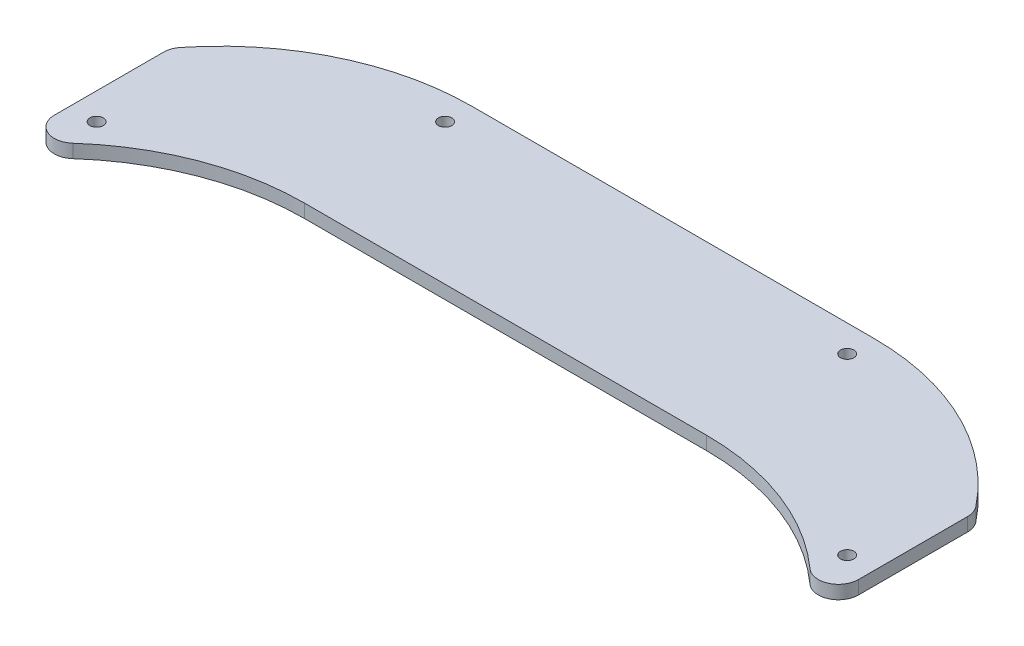
ISO-10303-21;
HEADER;
FILE_DESCRIPTION(('STEP AP214'),'2;1');
FILE_NAME('part.step','',(''),(''),'','','');
FILE_SCHEMA(('AUTOMOTIVE_DESIGN { 1 0 10303 214 1 1 1 1 }'));
ENDSEC;
DATA;
#1=APPLICATION_CONTEXT('core data for automotive mechanical design processes');
#2=APPLICATION_PROTOCOL_DEFINITION('international standard','automotive_design',2000,#1);
#3=PRODUCT_CONTEXT('',#1,'mechanical');
#4=PRODUCT('Part','Part','',(#3));
#5=PRODUCT_RELATED_PRODUCT_CATEGORY('part','',(#4));
#6=PRODUCT_DEFINITION_FORMATION('','',#4);
#7=PRODUCT_DEFINITION_CONTEXT('part definition',#1,'design');
#8=PRODUCT_DEFINITION('design','',#6,#7);
#9=PRODUCT_DEFINITION_SHAPE('','',#8);
#10=(LENGTH_UNIT() NAMED_UNIT(*) SI_UNIT(.MILLI.,.METRE.));
#11=(NAMED_UNIT(*) PLANE_ANGLE_UNIT() SI_UNIT($,.RADIAN.));
#12=(NAMED_UNIT(*) SI_UNIT($,.STERADIAN.) SOLID_ANGLE_UNIT());
#13=UNCERTAINTY_MEASURE_WITH_UNIT(LENGTH_MEASURE(1.E-05),#10,'distance_accuracy_value','');
#14=(GEOMETRIC_REPRESENTATION_CONTEXT(3) GLOBAL_UNCERTAINTY_ASSIGNED_CONTEXT((#13)) GLOBAL_UNIT_ASSIGNED_CONTEXT((#10,
#11,#12)) REPRESENTATION_CONTEXT('',''));
#15=CARTESIAN_POINT('',(0.,0.,0.));
#16=DIRECTION('',(0.,0.,1.));
#17=DIRECTION('',(1.,0.,0.));
#18=AXIS2_PLACEMENT_3D('',#15,#16,#17);
#19=CARTESIAN_POINT('',(-30.,2.,22.5));
#20=DIRECTION('',(0.,-1.,0.));
#21=DIRECTION('',(0.,0.,-1.));
#22=AXIS2_PLACEMENT_3D('',#19,#20,#21);
#23=CYLINDRICAL_SURFACE('',#22,37.5);
#24=CARTESIAN_POINT('',(-30.,2.,22.5));
#25=DIRECTION('',(0.,-1.,0.));
#26=DIRECTION('',(0.,0.,-1.));
#27=AXIS2_PLACEMENT_3D('',#24,#25,#26);
#28=CIRCLE('',#27,37.5);
#29=CARTESIAN_POINT('',(-55.,2.,-5.45084971874737));
#30=VERTEX_POINT('',#29);
#31=CARTESIAN_POINT('',(-30.,2.,-15.));
#32=VERTEX_POINT('',#31);
#33=EDGE_CURVE('E123',#30,#32,#28,.T.);
#34=ORIENTED_EDGE('',*,*,#33,.F.);
#35=DIRECTION('',(0.,-1.,0.));
#36=VECTOR('',#35,1.);
#37=CARTESIAN_POINT('',(-55.,2.,-5.45084971874738));
#38=LINE('',#37,#36);
#39=CARTESIAN_POINT('',(-55.,0.,-5.45084971874737));
#40=VERTEX_POINT('',#39);
#41=EDGE_CURVE('E11',#30,#40,#38,.T.);
#42=ORIENTED_EDGE('',*,*,#41,.T.);
#43=CARTESIAN_POINT('',(-30.,0.,22.5));
#44=DIRECTION('',(0.,-1.,0.));
#45=DIRECTION('',(0.,0.,-1.));
#46=AXIS2_PLACEMENT_3D('',#43,#44,#45);
#47=CIRCLE('',#46,37.5);
#48=CARTESIAN_POINT('',(-30.,0.,-15.));
#49=VERTEX_POINT('',#48);
#50=EDGE_CURVE('E148',#40,#49,#47,.T.);
#51=ORIENTED_EDGE('',*,*,#50,.T.);
#52=DIRECTION('',(0.,-1.,0.));
#53=VECTOR('',#52,1.);
#54=CARTESIAN_POINT('',(-30.,2.,-15.));
#55=LINE('',#54,#53);
#56=EDGE_CURVE('E141',#32,#49,#55,.T.);
#57=ORIENTED_EDGE('',*,*,#56,.F.);
#58=EDGE_LOOP('',(#34,#42,#51,#57));
#59=FACE_BOUND('',#58,.T.);
#60=ADVANCED_FACE('F34',(#59),#23,.F.);
#61=CARTESIAN_POINT('',(30.,2.,-15.));
#62=DIRECTION('',(0.,0.,-1.));
#63=DIRECTION('',(-1.,0.,0.));
#64=AXIS2_PLACEMENT_3D('',#61,#62,#63);
#65=PLANE('',#64);
#66=DIRECTION('',(1.,0.,0.));
#67=VECTOR('',#66,1.);
#68=CARTESIAN_POINT('',(30.,0.,-15.));
#69=LINE('',#68,#67);
#70=CARTESIAN_POINT('',(30.,0.,-15.));
#71=VERTEX_POINT('',#70);
#72=EDGE_CURVE('E221',#49,#71,#69,.T.);
#73=ORIENTED_EDGE('',*,*,#72,.T.);
#74=DIRECTION('',(0.,-1.,0.));
#75=VECTOR('',#74,1.);
#76=CARTESIAN_POINT('',(30.,2.,-15.));
#77=LINE('',#76,#75);
#78=CARTESIAN_POINT('',(30.,2.,-15.));
#79=VERTEX_POINT('',#78);
#80=EDGE_CURVE('E143',#79,#71,#77,.T.);
#81=ORIENTED_EDGE('',*,*,#80,.F.);
#82=DIRECTION('',(1.,0.,0.));
#83=VECTOR('',#82,1.);
#84=CARTESIAN_POINT('',(30.,2.,-15.));
#85=LINE('',#84,#83);
#86=EDGE_CURVE('E128',#32,#79,#85,.T.);
#87=ORIENTED_EDGE('',*,*,#86,.F.);
#88=ORIENTED_EDGE('',*,*,#56,.T.);
#89=EDGE_LOOP('',(#73,#81,#87,#88));
#90=FACE_BOUND('',#89,.T.);
#91=ADVANCED_FACE('F140',(#90),#65,.F.);
#92=CARTESIAN_POINT('',(30.,2.,22.5));
#93=DIRECTION('',(0.,-1.,0.));
#94=DIRECTION('',(0.,0.,-1.));
#95=AXIS2_PLACEMENT_3D('',#92,#93,#94);
#96=CYLINDRICAL_SURFACE('',#95,37.5);
#97=CARTESIAN_POINT('',(30.,0.,22.5));
#98=DIRECTION('',(0.,-1.,0.));
#99=DIRECTION('',(0.,0.,1.));
#100=AXIS2_PLACEMENT_3D('',#97,#98,#99);
#101=CIRCLE('',#100,37.5);
#102=CARTESIAN_POINT('',(55.,0.,-5.45084971874737));
#103=VERTEX_POINT('',#102);
#104=EDGE_CURVE('E203',#71,#103,#101,.T.);
#105=ORIENTED_EDGE('',*,*,#104,.T.);
#106=DIRECTION('',(0.,-1.,0.));
#107=VECTOR('',#106,1.);
#108=CARTESIAN_POINT('',(55.,2.,-5.45084971874738));
#109=LINE('',#108,#107);
#110=CARTESIAN_POINT('',(55.,2.,-5.45084971874737));
#111=VERTEX_POINT('',#110);
#112=EDGE_CURVE('E42',#103,#111,#109,.F.);
#113=ORIENTED_EDGE('',*,*,#112,.T.);
#114=CARTESIAN_POINT('',(30.,2.,22.5));
#115=DIRECTION('',(0.,-1.,0.));
#116=DIRECTION('',(0.,0.,1.));
#117=AXIS2_PLACEMENT_3D('',#114,#115,#116);
#118=CIRCLE('',#117,37.5);
#119=EDGE_CURVE('E145',#79,#111,#118,.T.);
#120=ORIENTED_EDGE('',*,*,#119,.F.);
#121=ORIENTED_EDGE('',*,*,#80,.T.);
#122=EDGE_LOOP('',(#105,#113,#120,#121));
#123=FACE_BOUND('',#122,.T.);
#124=ADVANCED_FACE('F201',(#123),#96,.F.);
#125=CARTESIAN_POINT('',(60.,2.,-25.));
#126=DIRECTION('',(-1.,0.,0.));
#127=DIRECTION('',(0.,0.,1.));
#128=AXIS2_PLACEMENT_3D('',#125,#126,#127);
#129=PLANE('',#128);
#130=DIRECTION('',(0.,0.,-1.));
#131=VECTOR('',#130,1.);
#132=CARTESIAN_POINT('',(60.,0.,-25.));
#133=LINE('',#132,#131);
#134=CARTESIAN_POINT('',(60.,0.,-7.68691769624717));
#135=VERTEX_POINT('',#134);
#136=CARTESIAN_POINT('',(60.,0.,-23.9767315949145));
#137=VERTEX_POINT('',#136);
#138=EDGE_CURVE('E212',#135,#137,#133,.T.);
#139=ORIENTED_EDGE('',*,*,#138,.T.);
#140=DIRECTION('',(0.,-1.,0.));
#141=VECTOR('',#140,1.);
#142=CARTESIAN_POINT('',(60.,2.,-23.9767315949145));
#143=LINE('',#142,#141);
#144=CARTESIAN_POINT('',(60.,2.,-23.9767315949145));
#145=VERTEX_POINT('',#144);
#146=EDGE_CURVE('E57',#137,#145,#143,.F.);
#147=ORIENTED_EDGE('',*,*,#146,.T.);
#148=DIRECTION('',(0.,0.,-1.));
#149=VECTOR('',#148,1.);
#150=CARTESIAN_POINT('',(60.,2.,-25.));
#151=LINE('',#150,#149);
#152=CARTESIAN_POINT('',(60.,2.,-7.68691769624717));
#153=VERTEX_POINT('',#152);
#154=EDGE_CURVE('E206',#153,#145,#151,.T.);
#155=ORIENTED_EDGE('',*,*,#154,.F.);
#156=DIRECTION('',(0.,-1.,0.));
#157=VECTOR('',#156,1.);
#158=CARTESIAN_POINT('',(60.,2.,-7.68691769624717));
#159=LINE('',#158,#157);
#160=EDGE_CURVE('E195',#153,#135,#159,.T.);
#161=ORIENTED_EDGE('',*,*,#160,.T.);
#162=EDGE_LOOP('',(#139,#147,#155,#161));
#163=FACE_BOUND('',#162,.T.);
#164=ADVANCED_FACE('F211',(#163),#129,.F.);
#165=CARTESIAN_POINT('',(30.,2.,-2.49999999999999));
#166=DIRECTION('',(0.,-1.,0.));
#167=DIRECTION('',(0.,0.,-1.));
#168=AXIS2_PLACEMENT_3D('',#165,#166,#167);
#169=CYLINDRICAL_SURFACE('',#168,37.5);
#170=CARTESIAN_POINT('',(30.,2.,-2.49999999999999));
#171=DIRECTION('',(0.,1.,0.));
#172=DIRECTION('',(0.,0.,-1.));
#173=AXIS2_PLACEMENT_3D('',#170,#171,#172);
#174=CIRCLE('',#173,37.5);
#175=CARTESIAN_POINT('',(59.3478260869565,2.,-25.8442734727332));
#176=VERTEX_POINT('',#175);
#177=CARTESIAN_POINT('',(30.,2.,-40.));
#178=VERTEX_POINT('',#177);
#179=EDGE_CURVE('E284',#176,#178,#174,.T.);
#180=ORIENTED_EDGE('',*,*,#179,.F.);
#181=DIRECTION('',(0.,-1.,0.));
#182=VECTOR('',#181,1.);
#183=CARTESIAN_POINT('',(59.3478260869565,2.,-25.8442734727332));
#184=LINE('',#183,#182);
#185=CARTESIAN_POINT('',(59.3478260869565,0.,-25.8442734727332));
#186=VERTEX_POINT('',#185);
#187=EDGE_CURVE('E192',#176,#186,#184,.T.);
#188=ORIENTED_EDGE('',*,*,#187,.T.);
#189=CARTESIAN_POINT('',(30.,0.,-2.49999999999999));
#190=DIRECTION('',(0.,1.,0.));
#191=DIRECTION('',(0.,0.,-1.));
#192=AXIS2_PLACEMENT_3D('',#189,#190,#191);
#193=CIRCLE('',#192,37.5);
#194=CARTESIAN_POINT('',(30.,0.,-40.));
#195=VERTEX_POINT('',#194);
#196=EDGE_CURVE('E217',#186,#195,#193,.T.);
#197=ORIENTED_EDGE('',*,*,#196,.T.);
#198=DIRECTION('',(0.,-1.,0.));
#199=VECTOR('',#198,1.);
#200=CARTESIAN_POINT('',(30.,2.,-40.));
#201=LINE('',#200,#199);
#202=EDGE_CURVE('E154',#178,#195,#201,.T.);
#203=ORIENTED_EDGE('',*,*,#202,.F.);
#204=EDGE_LOOP('',(#180,#188,#197,#203));
#205=FACE_BOUND('',#204,.T.);
#206=ADVANCED_FACE('F283',(#205),#169,.T.);
#207=CARTESIAN_POINT('',(-30.,2.,-40.));
#208=DIRECTION('',(0.,0.,1.));
#209=DIRECTION('',(1.,0.,0.));
#210=AXIS2_PLACEMENT_3D('',#207,#208,#209);
#211=PLANE('',#210);
#212=DIRECTION('',(-1.,0.,0.));
#213=VECTOR('',#212,1.);
#214=CARTESIAN_POINT('',(-30.,0.,-40.));
#215=LINE('',#214,#213);
#216=CARTESIAN_POINT('',(-30.,0.,-40.));
#217=VERTEX_POINT('',#216);
#218=EDGE_CURVE('E219',#195,#217,#215,.T.);
#219=ORIENTED_EDGE('',*,*,#218,.T.);
#220=DIRECTION('',(0.,-1.,0.));
#221=VECTOR('',#220,1.);
#222=CARTESIAN_POINT('',(-30.,2.,-40.));
#223=LINE('',#222,#221);
#224=CARTESIAN_POINT('',(-30.,2.,-40.));
#225=VERTEX_POINT('',#224);
#226=EDGE_CURVE('E231',#225,#217,#223,.T.);
#227=ORIENTED_EDGE('',*,*,#226,.F.);
#228=DIRECTION('',(-1.,0.,0.));
#229=VECTOR('',#228,1.);
#230=CARTESIAN_POINT('',(-30.,2.,-40.));
#231=LINE('',#230,#229);
#232=EDGE_CURVE('E241',#178,#225,#231,.T.);
#233=ORIENTED_EDGE('',*,*,#232,.F.);
#234=ORIENTED_EDGE('',*,*,#202,.T.);
#235=EDGE_LOOP('',(#219,#227,#233,#234));
#236=FACE_BOUND('',#235,.T.);
#237=ADVANCED_FACE('F239',(#236),#211,.F.);
#238=CARTESIAN_POINT('',(-30.,2.,-2.49999999999999));
#239=DIRECTION('',(0.,-1.,0.));
#240=DIRECTION('',(0.,0.,-1.));
#241=AXIS2_PLACEMENT_3D('',#238,#239,#240);
#242=CYLINDRICAL_SURFACE('',#241,37.5);
#243=CARTESIAN_POINT('',(-30.,0.,-2.49999999999999));
#244=DIRECTION('',(0.,1.,0.));
#245=DIRECTION('',(0.,0.,1.));
#246=AXIS2_PLACEMENT_3D('',#243,#244,#245);
#247=CIRCLE('',#246,37.5);
#248=CARTESIAN_POINT('',(-59.3478260869565,0.,-25.8442734727332));
#249=VERTEX_POINT('',#248);
#250=EDGE_CURVE('E226',#217,#249,#247,.T.);
#251=ORIENTED_EDGE('',*,*,#250,.T.);
#252=DIRECTION('',(0.,-1.,0.));
#253=VECTOR('',#252,1.);
#254=CARTESIAN_POINT('',(-59.3478260869565,2.,-25.8442734727332));
#255=LINE('',#254,#253);
#256=CARTESIAN_POINT('',(-59.3478260869565,2.,-25.8442734727332));
#257=VERTEX_POINT('',#256);
#258=EDGE_CURVE('E184',#249,#257,#255,.F.);
#259=ORIENTED_EDGE('',*,*,#258,.T.);
#260=CARTESIAN_POINT('',(-30.,2.,-2.49999999999999));
#261=DIRECTION('',(0.,1.,0.));
#262=DIRECTION('',(0.,0.,1.));
#263=AXIS2_PLACEMENT_3D('',#260,#261,#262);
#264=CIRCLE('',#263,37.5);
#265=EDGE_CURVE('E253',#225,#257,#264,.T.);
#266=ORIENTED_EDGE('',*,*,#265,.F.);
#267=ORIENTED_EDGE('',*,*,#226,.T.);
#268=EDGE_LOOP('',(#251,#259,#266,#267));
#269=FACE_BOUND('',#268,.T.);
#270=ADVANCED_FACE('F246',(#269),#242,.T.);
#271=CARTESIAN_POINT('',(-60.,2.,-25.));
#272=DIRECTION('',(1.,0.,0.));
#273=DIRECTION('',(0.,0.,-1.));
#274=AXIS2_PLACEMENT_3D('',#271,#272,#273);
#275=PLANE('',#274);
#276=DIRECTION('',(0.,0.,1.));
#277=VECTOR('',#276,1.);
#278=CARTESIAN_POINT('',(-60.,2.,-25.));
#279=LINE('',#278,#277);
#280=CARTESIAN_POINT('',(-60.,2.,-23.9767315949145));
#281=VERTEX_POINT('',#280);
#282=CARTESIAN_POINT('',(-60.,2.,-7.68691769624717));
#283=VERTEX_POINT('',#282);
#284=EDGE_CURVE('E233',#281,#283,#279,.T.);
#285=ORIENTED_EDGE('',*,*,#284,.F.);
#286=DIRECTION('',(0.,-1.,0.));
#287=VECTOR('',#286,1.);
#288=CARTESIAN_POINT('',(-60.,2.,-23.9767315949145));
#289=LINE('',#288,#287);
#290=CARTESIAN_POINT('',(-60.,0.,-23.9767315949145));
#291=VERTEX_POINT('',#290);
#292=EDGE_CURVE('E152',#281,#291,#289,.T.);
#293=ORIENTED_EDGE('',*,*,#292,.T.);
#294=DIRECTION('',(0.,0.,1.));
#295=VECTOR('',#294,1.);
#296=CARTESIAN_POINT('',(-60.,0.,-25.));
#297=LINE('',#296,#295);
#298=CARTESIAN_POINT('',(-60.,0.,-7.68691769624717));
#299=VERTEX_POINT('',#298);
#300=EDGE_CURVE('E136',#291,#299,#297,.T.);
#301=ORIENTED_EDGE('',*,*,#300,.T.);
#302=DIRECTION('',(0.,-1.,0.));
#303=VECTOR('',#302,1.);
#304=CARTESIAN_POINT('',(-60.,2.,-7.68691769624717));
#305=LINE('',#304,#303);
#306=EDGE_CURVE('E150',#299,#283,#305,.F.);
#307=ORIENTED_EDGE('',*,*,#306,.T.);
#308=EDGE_LOOP('',(#285,#293,#301,#307));
#309=FACE_BOUND('',#308,.T.);
#310=ADVANCED_FACE('F255',(#309),#275,.F.);
#311=CARTESIAN_POINT('',(-30.,2.,22.5));
#312=DIRECTION('',(0.,-1.,0.));
#313=DIRECTION('',(0.,0.,-1.));
#314=AXIS2_PLACEMENT_3D('',#311,#312,#313);
#315=PLANE('',#314);
#316=CARTESIAN_POINT('',(-30.,2.,-36.));
#317=DIRECTION('',(0.,1.,0.));
#318=DIRECTION('',(0.,0.,-1.));
#319=AXIS2_PLACEMENT_3D('',#316,#317,#318);
#320=CIRCLE('',#319,1.);
#321=CARTESIAN_POINT('',(-30.,2.,-37.));
#322=VERTEX_POINT('',#321);
#323=EDGE_CURVE('E172',#322,#322,#320,.T.);
#324=ORIENTED_EDGE('',*,*,#323,.F.);
#325=EDGE_LOOP('',(#324));
#326=FACE_BOUND('',#325,.T.);
#327=CARTESIAN_POINT('',(-56.,2.,-9.99999999999999));
#328=DIRECTION('',(0.,1.,0.));
#329=DIRECTION('',(0.,0.,-1.));
#330=AXIS2_PLACEMENT_3D('',#327,#328,#329);
#331=CIRCLE('',#330,0.999999999999998);
#332=CARTESIAN_POINT('',(-56.,2.,-11.));
#333=VERTEX_POINT('',#332);
#334=EDGE_CURVE('E169',#333,#333,#331,.T.);
#335=ORIENTED_EDGE('',*,*,#334,.F.);
#336=EDGE_LOOP('',(#335));
#337=FACE_BOUND('',#336,.T.);
#338=CARTESIAN_POINT('',(30.,2.,-36.));
#339=DIRECTION('',(0.,1.,0.));
#340=DIRECTION('',(0.,0.,1.));
#341=AXIS2_PLACEMENT_3D('',#338,#339,#340);
#342=CIRCLE('',#341,1.);
#343=CARTESIAN_POINT('',(30.,2.,-35.));
#344=VERTEX_POINT('',#343);
#345=EDGE_CURVE('E165',#344,#344,#342,.T.);
#346=ORIENTED_EDGE('',*,*,#345,.F.);
#347=EDGE_LOOP('',(#346));
#348=FACE_BOUND('',#347,.T.);
#349=CARTESIAN_POINT('',(56.,2.,-10.));
#350=DIRECTION('',(0.,1.,0.));
#351=DIRECTION('',(0.,0.,1.));
#352=AXIS2_PLACEMENT_3D('',#349,#350,#351);
#353=CIRCLE('',#352,0.999999999999998);
#354=CARTESIAN_POINT('',(56.,2.,-9.00000000000001));
#355=VERTEX_POINT('',#354);
#356=EDGE_CURVE('E161',#355,#355,#353,.T.);
#357=ORIENTED_EDGE('',*,*,#356,.F.);
#358=EDGE_LOOP('',(#357));
#359=FACE_BOUND('',#358,.T.);
#360=ORIENTED_EDGE('',*,*,#265,.T.);
#361=CARTESIAN_POINT('',(-57.,2.,-23.9767315949145));
#362=DIRECTION('',(0.,-1.,0.));
#363=DIRECTION('',(0.,0.,-1.));
#364=AXIS2_PLACEMENT_3D('',#361,#362,#363);
#365=CIRCLE('',#364,3.);
#366=EDGE_CURVE('E190',#257,#281,#365,.F.);
#367=ORIENTED_EDGE('',*,*,#366,.T.);
#368=ORIENTED_EDGE('',*,*,#284,.T.);
#369=CARTESIAN_POINT('',(-57.,2.,-7.68691769624717));
#370=DIRECTION('',(0.,-1.,0.));
#371=DIRECTION('',(0.,0.,-1.));
#372=AXIS2_PLACEMENT_3D('',#369,#370,#371);
#373=CIRCLE('',#372,3.);
#374=EDGE_CURVE('E132',#283,#30,#373,.F.);
#375=ORIENTED_EDGE('',*,*,#374,.T.);
#376=ORIENTED_EDGE('',*,*,#33,.T.);
#377=ORIENTED_EDGE('',*,*,#86,.T.);
#378=ORIENTED_EDGE('',*,*,#119,.T.);
#379=CARTESIAN_POINT('',(57.,2.,-7.68691769624717));
#380=DIRECTION('',(0.,-1.,0.));
#381=DIRECTION('',(0.,0.,-1.));
#382=AXIS2_PLACEMENT_3D('',#379,#380,#381);
#383=CIRCLE('',#382,3.);
#384=EDGE_CURVE('E187',#111,#153,#383,.F.);
#385=ORIENTED_EDGE('',*,*,#384,.T.);
#386=ORIENTED_EDGE('',*,*,#154,.T.);
#387=CARTESIAN_POINT('',(57.,2.,-23.9767315949145));
#388=DIRECTION('',(0.,-1.,0.));
#389=DIRECTION('',(0.,0.,-1.));
#390=AXIS2_PLACEMENT_3D('',#387,#388,#389);
#391=CIRCLE('',#390,3.);
#392=EDGE_CURVE('E49',#145,#176,#391,.F.);
#393=ORIENTED_EDGE('',*,*,#392,.T.);
#394=ORIENTED_EDGE('',*,*,#179,.T.);
#395=ORIENTED_EDGE('',*,*,#232,.T.);
#396=EDGE_LOOP('',(#360,#367,#368,#375,#376,#377,#378,#385,#386,#393,#394,#395));
#397=FACE_BOUND('',#396,.T.);
#398=ADVANCED_FACE('F126',(#326,#337,#348,#359,#397),#315,.F.);
#399=CARTESIAN_POINT('',(-30.,0.,22.5));
#400=DIRECTION('',(0.,-1.,0.));
#401=DIRECTION('',(0.,0.,-1.));
#402=AXIS2_PLACEMENT_3D('',#399,#400,#401);
#403=PLANE('',#402);
#404=CARTESIAN_POINT('',(-30.,0.,-36.));
#405=DIRECTION('',(0.,-1.,0.));
#406=DIRECTION('',(0.,0.,-1.));
#407=AXIS2_PLACEMENT_3D('',#404,#405,#406);
#408=CIRCLE('',#407,1.);
#409=CARTESIAN_POINT('',(-30.,0.,-37.));
#410=VERTEX_POINT('',#409);
#411=EDGE_CURVE('E170',#410,#410,#408,.T.);
#412=ORIENTED_EDGE('',*,*,#411,.F.);
#413=EDGE_LOOP('',(#412));
#414=FACE_BOUND('',#413,.T.);
#415=CARTESIAN_POINT('',(-56.,0.,-9.99999999999999));
#416=DIRECTION('',(0.,-1.,0.));
#417=DIRECTION('',(0.,0.,-1.));
#418=AXIS2_PLACEMENT_3D('',#415,#416,#417);
#419=CIRCLE('',#418,0.999999999999998);
#420=CARTESIAN_POINT('',(-56.,0.,-11.));
#421=VERTEX_POINT('',#420);
#422=EDGE_CURVE('E166',#421,#421,#419,.T.);
#423=ORIENTED_EDGE('',*,*,#422,.F.);
#424=EDGE_LOOP('',(#423));
#425=FACE_BOUND('',#424,.T.);
#426=CARTESIAN_POINT('',(30.,0.,-36.));
#427=DIRECTION('',(0.,-1.,0.));
#428=DIRECTION('',(0.,0.,-1.));
#429=AXIS2_PLACEMENT_3D('',#426,#427,#428);
#430=CIRCLE('',#429,1.);
#431=CARTESIAN_POINT('',(30.,0.,-37.));
#432=VERTEX_POINT('',#431);
#433=EDGE_CURVE('E162',#432,#432,#430,.T.);
#434=ORIENTED_EDGE('',*,*,#433,.F.);
#435=EDGE_LOOP('',(#434));
#436=FACE_BOUND('',#435,.T.);
#437=CARTESIAN_POINT('',(56.,0.,-10.));
#438=DIRECTION('',(0.,-1.,0.));
#439=DIRECTION('',(0.,0.,-1.));
#440=AXIS2_PLACEMENT_3D('',#437,#438,#439);
#441=CIRCLE('',#440,0.999999999999998);
#442=CARTESIAN_POINT('',(56.,0.,-11.));
#443=VERTEX_POINT('',#442);
#444=EDGE_CURVE('E158',#443,#443,#441,.T.);
#445=ORIENTED_EDGE('',*,*,#444,.F.);
#446=EDGE_LOOP('',(#445));
#447=FACE_BOUND('',#446,.T.);
#448=ORIENTED_EDGE('',*,*,#300,.F.);
#449=CARTESIAN_POINT('',(-57.,0.,-23.9767315949145));
#450=DIRECTION('',(0.,-1.,0.));
#451=DIRECTION('',(0.,0.,-1.));
#452=AXIS2_PLACEMENT_3D('',#449,#450,#451);
#453=CIRCLE('',#452,3.);
#454=EDGE_CURVE('E182',#291,#249,#453,.T.);
#455=ORIENTED_EDGE('',*,*,#454,.T.);
#456=ORIENTED_EDGE('',*,*,#250,.F.);
#457=ORIENTED_EDGE('',*,*,#218,.F.);
#458=ORIENTED_EDGE('',*,*,#196,.F.);
#459=CARTESIAN_POINT('',(57.,0.,-23.9767315949145));
#460=DIRECTION('',(0.,-1.,0.));
#461=DIRECTION('',(0.,0.,-1.));
#462=AXIS2_PLACEMENT_3D('',#459,#460,#461);
#463=CIRCLE('',#462,3.);
#464=EDGE_CURVE('E180',#186,#137,#463,.T.);
#465=ORIENTED_EDGE('',*,*,#464,.T.);
#466=ORIENTED_EDGE('',*,*,#138,.F.);
#467=CARTESIAN_POINT('',(57.,0.,-7.68691769624717));
#468=DIRECTION('',(0.,-1.,0.));
#469=DIRECTION('',(0.,0.,-1.));
#470=AXIS2_PLACEMENT_3D('',#467,#468,#469);
#471=CIRCLE('',#470,3.);
#472=EDGE_CURVE('E178',#135,#103,#471,.T.);
#473=ORIENTED_EDGE('',*,*,#472,.T.);
#474=ORIENTED_EDGE('',*,*,#104,.F.);
#475=ORIENTED_EDGE('',*,*,#72,.F.);
#476=ORIENTED_EDGE('',*,*,#50,.F.);
#477=CARTESIAN_POINT('',(-57.,0.,-7.68691769624717));
#478=DIRECTION('',(0.,-1.,0.));
#479=DIRECTION('',(0.,0.,-1.));
#480=AXIS2_PLACEMENT_3D('',#477,#478,#479);
#481=CIRCLE('',#480,3.);
#482=EDGE_CURVE('E176',#40,#299,#481,.T.);
#483=ORIENTED_EDGE('',*,*,#482,.T.);
#484=EDGE_LOOP('',(#448,#455,#456,#457,#458,#465,#466,#473,#474,#475,#476,#483));
#485=FACE_BOUND('',#484,.T.);
#486=ADVANCED_FACE('F215',(#414,#425,#436,#447,#485),#403,.T.);
#487=CARTESIAN_POINT('',(56.,-1.,-10.));
#488=DIRECTION('',(0.,1.,0.));
#489=DIRECTION('',(0.,0.,1.));
#490=AXIS2_PLACEMENT_3D('',#487,#488,#489);
#491=CYLINDRICAL_SURFACE('',#490,0.999999999999998);
#492=ORIENTED_EDGE('',*,*,#444,.T.);
#493=EDGE_LOOP('',(#492));
#494=FACE_BOUND('',#493,.T.);
#495=ORIENTED_EDGE('',*,*,#356,.T.);
#496=EDGE_LOOP('',(#495));
#497=FACE_BOUND('',#496,.T.);
#498=ADVANCED_FACE('F307',(#494,#497),#491,.F.);
#499=CARTESIAN_POINT('',(30.,-1.,-36.));
#500=DIRECTION('',(0.,1.,0.));
#501=DIRECTION('',(0.,0.,1.));
#502=AXIS2_PLACEMENT_3D('',#499,#500,#501);
#503=CYLINDRICAL_SURFACE('',#502,1.);
#504=ORIENTED_EDGE('',*,*,#433,.T.);
#505=EDGE_LOOP('',(#504));
#506=FACE_BOUND('',#505,.T.);
#507=ORIENTED_EDGE('',*,*,#345,.T.);
#508=EDGE_LOOP('',(#507));
#509=FACE_BOUND('',#508,.T.);
#510=ADVANCED_FACE('F309',(#506,#509),#503,.F.);
#511=CARTESIAN_POINT('',(-56.,-1.,-9.99999999999999));
#512=DIRECTION('',(0.,1.,0.));
#513=DIRECTION('',(0.,0.,1.));
#514=AXIS2_PLACEMENT_3D('',#511,#512,#513);
#515=CYLINDRICAL_SURFACE('',#514,0.999999999999998);
#516=ORIENTED_EDGE('',*,*,#422,.T.);
#517=EDGE_LOOP('',(#516));
#518=FACE_BOUND('',#517,.T.);
#519=ORIENTED_EDGE('',*,*,#334,.T.);
#520=EDGE_LOOP('',(#519));
#521=FACE_BOUND('',#520,.T.);
#522=ADVANCED_FACE('F316',(#518,#521),#515,.F.);
#523=CARTESIAN_POINT('',(-30.,-1.,-36.));
#524=DIRECTION('',(0.,1.,0.));
#525=DIRECTION('',(0.,0.,1.));
#526=AXIS2_PLACEMENT_3D('',#523,#524,#525);
#527=CYLINDRICAL_SURFACE('',#526,1.);
#528=ORIENTED_EDGE('',*,*,#411,.T.);
#529=EDGE_LOOP('',(#528));
#530=FACE_BOUND('',#529,.T.);
#531=ORIENTED_EDGE('',*,*,#323,.T.);
#532=EDGE_LOOP('',(#531));
#533=FACE_BOUND('',#532,.T.);
#534=ADVANCED_FACE('F277',(#530,#533),#527,.F.);
#535=CARTESIAN_POINT('',(-57.,2.,-23.9767315949145));
#536=DIRECTION('',(0.,-1.,0.));
#537=DIRECTION('',(0.,0.,-1.));
#538=AXIS2_PLACEMENT_3D('',#535,#536,#537);
#539=CYLINDRICAL_SURFACE('',#538,3.);
#540=ORIENTED_EDGE('',*,*,#366,.F.);
#541=ORIENTED_EDGE('',*,*,#258,.F.);
#542=ORIENTED_EDGE('',*,*,#454,.F.);
#543=ORIENTED_EDGE('',*,*,#292,.F.);
#544=EDGE_LOOP('',(#540,#541,#542,#543));
#545=FACE_BOUND('',#544,.T.);
#546=ADVANCED_FACE('F250',(#545),#539,.T.);
#547=CARTESIAN_POINT('',(57.,2.,-23.9767315949145));
#548=DIRECTION('',(0.,-1.,0.));
#549=DIRECTION('',(0.,0.,-1.));
#550=AXIS2_PLACEMENT_3D('',#547,#548,#549);
#551=CYLINDRICAL_SURFACE('',#550,3.);
#552=ORIENTED_EDGE('',*,*,#392,.F.);
#553=ORIENTED_EDGE('',*,*,#146,.F.);
#554=ORIENTED_EDGE('',*,*,#464,.F.);
#555=ORIENTED_EDGE('',*,*,#187,.F.);
#556=EDGE_LOOP('',(#552,#553,#554,#555));
#557=FACE_BOUND('',#556,.T.);
#558=ADVANCED_FACE('F266',(#557),#551,.T.);
#559=CARTESIAN_POINT('',(57.,2.,-7.68691769624717));
#560=DIRECTION('',(0.,-1.,0.));
#561=DIRECTION('',(0.,0.,-1.));
#562=AXIS2_PLACEMENT_3D('',#559,#560,#561);
#563=CYLINDRICAL_SURFACE('',#562,3.);
#564=ORIENTED_EDGE('',*,*,#384,.F.);
#565=ORIENTED_EDGE('',*,*,#112,.F.);
#566=ORIENTED_EDGE('',*,*,#472,.F.);
#567=ORIENTED_EDGE('',*,*,#160,.F.);
#568=EDGE_LOOP('',(#564,#565,#566,#567));
#569=FACE_BOUND('',#568,.T.);
#570=ADVANCED_FACE('F209',(#569),#563,.T.);
#571=CARTESIAN_POINT('',(-57.,2.,-7.68691769624717));
#572=DIRECTION('',(0.,-1.,0.));
#573=DIRECTION('',(0.,0.,-1.));
#574=AXIS2_PLACEMENT_3D('',#571,#572,#573);
#575=CYLINDRICAL_SURFACE('',#574,3.);
#576=ORIENTED_EDGE('',*,*,#374,.F.);
#577=ORIENTED_EDGE('',*,*,#306,.F.);
#578=ORIENTED_EDGE('',*,*,#482,.F.);
#579=ORIENTED_EDGE('',*,*,#41,.F.);
#580=EDGE_LOOP('',(#576,#577,#578,#579));
#581=FACE_BOUND('',#580,.T.);
#582=ADVANCED_FACE('F36',(#581),#575,.T.);
#583=CLOSED_SHELL('',(#60,#91,#124,#164,#206,#237,#270,#310,#398,#486,#498,#510,#522,#534,#546,
#558,#570,#582));
#584=MANIFOLD_SOLID_BREP('B2',#583);
#585=ADVANCED_BREP_SHAPE_REPRESENTATION('',(#18,#584),#14);
#586=SHAPE_DEFINITION_REPRESENTATION(#9,#585);
ENDSEC;
END-ISO-10303-21;
